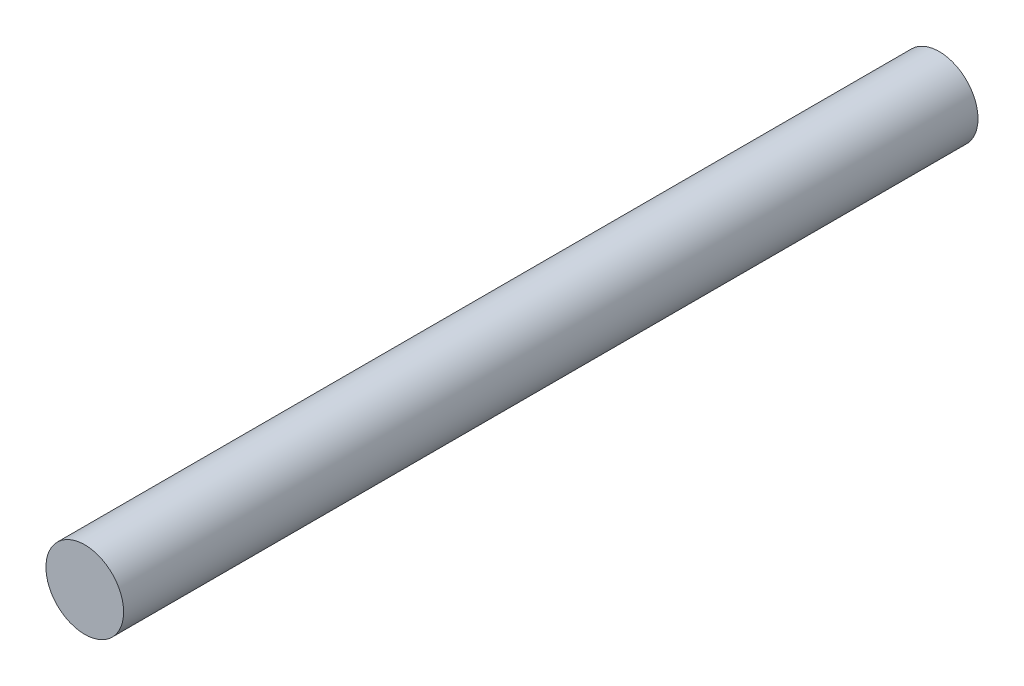
ISO-10303-21;
HEADER;
FILE_DESCRIPTION(('STEP AP214'),'2;1');
FILE_NAME('part.step','',(''),(''),'','','');
FILE_SCHEMA(('AUTOMOTIVE_DESIGN { 1 0 10303 214 1 1 1 1 }'));
ENDSEC;
DATA;
#1=APPLICATION_CONTEXT('core data for automotive mechanical design processes');
#2=APPLICATION_PROTOCOL_DEFINITION('international standard','automotive_design',2000,#1);
#3=PRODUCT_CONTEXT('',#1,'mechanical');
#4=PRODUCT('Part','Part','',(#3));
#5=PRODUCT_RELATED_PRODUCT_CATEGORY('part','',(#4));
#6=PRODUCT_DEFINITION_FORMATION('','',#4);
#7=PRODUCT_DEFINITION_CONTEXT('part definition',#1,'design');
#8=PRODUCT_DEFINITION('design','',#6,#7);
#9=PRODUCT_DEFINITION_SHAPE('','',#8);
#10=(LENGTH_UNIT() NAMED_UNIT(*) SI_UNIT(.MILLI.,.METRE.));
#11=(NAMED_UNIT(*) PLANE_ANGLE_UNIT() SI_UNIT($,.RADIAN.));
#12=(NAMED_UNIT(*) SI_UNIT($,.STERADIAN.) SOLID_ANGLE_UNIT());
#13=UNCERTAINTY_MEASURE_WITH_UNIT(LENGTH_MEASURE(1.E-05),#10,'distance_accuracy_value','');
#14=(GEOMETRIC_REPRESENTATION_CONTEXT(3) GLOBAL_UNCERTAINTY_ASSIGNED_CONTEXT((#13)) GLOBAL_UNIT_ASSIGNED_CONTEXT((#10,
#11,#12)) REPRESENTATION_CONTEXT('',''));
#15=CARTESIAN_POINT('',(0.,0.,0.));
#16=DIRECTION('',(0.,0.,1.));
#17=DIRECTION('',(1.,0.,0.));
#18=AXIS2_PLACEMENT_3D('',#15,#16,#17);
#19=CARTESIAN_POINT('',(0.,0.,27.5));
#20=DIRECTION('',(0.,0.,-1.));
#21=DIRECTION('',(-1.,0.,0.));
#22=AXIS2_PLACEMENT_3D('',#19,#20,#21);
#23=CYLINDRICAL_SURFACE('',#22,1.25);
#24=CARTESIAN_POINT('',(0.,0.,27.5));
#25=DIRECTION('',(0.,0.,1.));
#26=DIRECTION('',(1.,0.,0.));
#27=AXIS2_PLACEMENT_3D('',#24,#25,#26);
#28=CIRCLE('',#27,1.25);
#29=CARTESIAN_POINT('',(1.25,0.,27.5));
#30=VERTEX_POINT('',#29);
#31=EDGE_CURVE('E10',#30,#30,#28,.T.);
#32=ORIENTED_EDGE('',*,*,#31,.F.);
#33=EDGE_LOOP('',(#32));
#34=FACE_BOUND('',#33,.T.);
#35=CARTESIAN_POINT('',(0.,0.,0.));
#36=DIRECTION('',(0.,0.,1.));
#37=DIRECTION('',(1.,0.,0.));
#38=AXIS2_PLACEMENT_3D('',#35,#36,#37);
#39=CIRCLE('',#38,1.25);
#40=CARTESIAN_POINT('',(1.25,0.,0.));
#41=VERTEX_POINT('',#40);
#42=EDGE_CURVE('E38',#41,#41,#39,.T.);
#43=ORIENTED_EDGE('',*,*,#42,.T.);
#44=EDGE_LOOP('',(#43));
#45=FACE_BOUND('',#44,.T.);
#46=ADVANCED_FACE('F35',(#34,#45),#23,.T.);
#47=CARTESIAN_POINT('',(0.,0.,27.5));
#48=DIRECTION('',(0.,0.,1.));
#49=DIRECTION('',(1.,0.,0.));
#50=AXIS2_PLACEMENT_3D('',#47,#48,#49);
#51=PLANE('',#50);
#52=ORIENTED_EDGE('',*,*,#31,.T.);
#53=EDGE_LOOP('',(#52));
#54=FACE_BOUND('',#53,.T.);
#55=ADVANCED_FACE('F50',(#54),#51,.T.);
#56=CARTESIAN_POINT('',(0.,0.,0.));
#57=DIRECTION('',(0.,0.,1.));
#58=DIRECTION('',(1.,0.,0.));
#59=AXIS2_PLACEMENT_3D('',#56,#57,#58);
#60=PLANE('',#59);
#61=ORIENTED_EDGE('',*,*,#42,.F.);
#62=EDGE_LOOP('',(#61));
#63=FACE_BOUND('',#62,.T.);
#64=ADVANCED_FACE('F48',(#63),#60,.F.);
#65=CLOSED_SHELL('',(#46,#55,#64));
#66=MANIFOLD_SOLID_BREP('B2',#65);
#67=ADVANCED_BREP_SHAPE_REPRESENTATION('',(#18,#66),#14);
#68=SHAPE_DEFINITION_REPRESENTATION(#9,#67);
ENDSEC;
END-ISO-10303-21;
